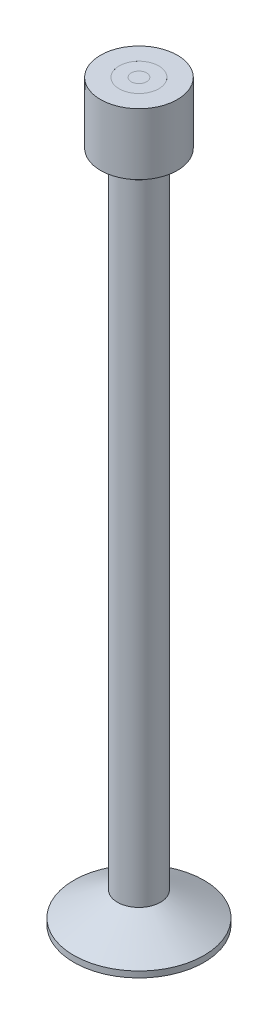
ISO-10303-21;
HEADER;
FILE_DESCRIPTION(('STEP AP214'),'2;1');
FILE_NAME('part.step','',(''),(''),'','','');
FILE_SCHEMA(('AUTOMOTIVE_DESIGN { 1 0 10303 214 1 1 1 1 }'));
ENDSEC;
DATA;
#1=APPLICATION_CONTEXT('core data for automotive mechanical design processes');
#2=APPLICATION_PROTOCOL_DEFINITION('international standard','automotive_design',2000,#1);
#3=PRODUCT_CONTEXT('',#1,'mechanical');
#4=PRODUCT('Part','Part','',(#3));
#5=PRODUCT_RELATED_PRODUCT_CATEGORY('part','',(#4));
#6=PRODUCT_DEFINITION_FORMATION('','',#4);
#7=PRODUCT_DEFINITION_CONTEXT('part definition',#1,'design');
#8=PRODUCT_DEFINITION('design','',#6,#7);
#9=PRODUCT_DEFINITION_SHAPE('','',#8);
#10=(LENGTH_UNIT() NAMED_UNIT(*) SI_UNIT(.MILLI.,.METRE.));
#11=(NAMED_UNIT(*) PLANE_ANGLE_UNIT() SI_UNIT($,.RADIAN.));
#12=(NAMED_UNIT(*) SI_UNIT($,.STERADIAN.) SOLID_ANGLE_UNIT());
#13=UNCERTAINTY_MEASURE_WITH_UNIT(LENGTH_MEASURE(1.E-05),#10,'distance_accuracy_value','');
#14=(GEOMETRIC_REPRESENTATION_CONTEXT(3) GLOBAL_UNCERTAINTY_ASSIGNED_CONTEXT((#13)) GLOBAL_UNIT_ASSIGNED_CONTEXT((#10,
#11,#12)) REPRESENTATION_CONTEXT('',''));
#15=CARTESIAN_POINT('',(0.,0.,0.));
#16=DIRECTION('',(0.,0.,1.));
#17=DIRECTION('',(1.,0.,0.));
#18=AXIS2_PLACEMENT_3D('',#15,#16,#17);
#19=CARTESIAN_POINT('',(0.,55.5,0.));
#20=DIRECTION('',(0.,1.,0.));
#21=DIRECTION('',(0.,0.,1.));
#22=AXIS2_PLACEMENT_3D('',#19,#20,#21);
#23=CYLINDRICAL_SURFACE('',#22,0.375);
#24=CARTESIAN_POINT('',(0.,0.,0.));
#25=DIRECTION('',(0.,1.,0.));
#26=DIRECTION('',(0.,0.,1.));
#27=AXIS2_PLACEMENT_3D('',#24,#25,#26);
#28=CIRCLE('',#27,0.375);
#29=CARTESIAN_POINT('',(0.,0.,0.375));
#30=VERTEX_POINT('',#29);
#31=EDGE_CURVE('E64',#30,#30,#28,.T.);
#32=ORIENTED_EDGE('',*,*,#31,.F.);
#33=EDGE_LOOP('',(#32));
#34=FACE_BOUND('',#33,.T.);
#35=CARTESIAN_POINT('',(0.,54.9421933085502,0.));
#36=DIRECTION('',(0.,1.,0.));
#37=DIRECTION('',(0.,0.,1.));
#38=AXIS2_PLACEMENT_3D('',#35,#36,#37);
#39=CIRCLE('',#38,0.375);
#40=CARTESIAN_POINT('',(0.,54.9421933085502,0.375));
#41=VERTEX_POINT('',#40);
#42=EDGE_CURVE('E11',#41,#41,#39,.T.);
#43=ORIENTED_EDGE('',*,*,#42,.T.);
#44=EDGE_LOOP('',(#43));
#45=FACE_BOUND('',#44,.T.);
#46=ADVANCED_FACE('F42',(#34,#45),#23,.F.);
#47=CARTESIAN_POINT('',(0.,60.571,0.));
#48=DIRECTION('',(0.,1.,0.));
#49=DIRECTION('',(0.,0.,1.));
#50=AXIS2_PLACEMENT_3D('',#47,#48,#49);
#51=CONICAL_SURFACE('',#50,0.635000000000092,0.0461581536129454);
#52=ORIENTED_EDGE('',*,*,#42,.F.);
#53=EDGE_LOOP('',(#52));
#54=FACE_BOUND('',#53,.T.);
#55=CARTESIAN_POINT('',(0.,60.571,0.));
#56=DIRECTION('',(0.,1.,0.));
#57=DIRECTION('',(0.,0.,1.));
#58=AXIS2_PLACEMENT_3D('',#55,#56,#57);
#59=CIRCLE('',#58,0.635000000000092);
#60=CARTESIAN_POINT('',(0.,60.571,0.635000000000092));
#61=VERTEX_POINT('',#60);
#62=EDGE_CURVE('E48',#61,#61,#59,.T.);
#63=ORIENTED_EDGE('',*,*,#62,.T.);
#64=EDGE_LOOP('',(#63));
#65=FACE_BOUND('',#64,.T.);
#66=ADVANCED_FACE('F71',(#54,#65),#51,.F.);
#67=CARTESIAN_POINT('',(0.635000000000092,60.571,0.));
#68=DIRECTION('',(0.,-1.,0.));
#69=DIRECTION('',(0.,0.,-1.));
#70=AXIS2_PLACEMENT_3D('',#67,#68,#69);
#71=PLANE('',#70);
#72=ORIENTED_EDGE('',*,*,#62,.F.);
#73=EDGE_LOOP('',(#72));
#74=FACE_BOUND('',#73,.T.);
#75=CARTESIAN_POINT('',(0.,60.571,0.));
#76=DIRECTION('',(0.,1.,0.));
#77=DIRECTION('',(0.,0.,1.));
#78=AXIS2_PLACEMENT_3D('',#75,#76,#77);
#79=CIRCLE('',#78,1.63500000000009);
#80=CARTESIAN_POINT('',(0.,60.571,1.63500000000009));
#81=VERTEX_POINT('',#80);
#82=EDGE_CURVE('E52',#81,#81,#79,.T.);
#83=ORIENTED_EDGE('',*,*,#82,.T.);
#84=EDGE_LOOP('',(#83));
#85=FACE_BOUND('',#84,.T.);
#86=ADVANCED_FACE('F75',(#74,#85),#71,.F.);
#87=CARTESIAN_POINT('',(0.,54.9421933085502,0.));
#88=DIRECTION('',(0.,1.,0.));
#89=DIRECTION('',(0.,0.,1.));
#90=AXIS2_PLACEMENT_3D('',#87,#88,#89);
#91=CONICAL_SURFACE('',#90,1.37500000000001,0.0461581536129434);
#92=ORIENTED_EDGE('',*,*,#82,.F.);
#93=EDGE_LOOP('',(#92));
#94=FACE_BOUND('',#93,.T.);
#95=CARTESIAN_POINT('',(0.,54.9421933085502,0.));
#96=DIRECTION('',(0.,1.,0.));
#97=DIRECTION('',(0.,0.,1.));
#98=AXIS2_PLACEMENT_3D('',#95,#96,#97);
#99=CIRCLE('',#98,1.37500000000001);
#100=CARTESIAN_POINT('',(0.,54.9421933085502,1.37500000000001));
#101=VERTEX_POINT('',#100);
#102=EDGE_CURVE('E56',#101,#101,#99,.T.);
#103=ORIENTED_EDGE('',*,*,#102,.T.);
#104=EDGE_LOOP('',(#103));
#105=FACE_BOUND('',#104,.T.);
#106=ADVANCED_FACE('F80',(#94,#105),#91,.T.);
#107=CARTESIAN_POINT('',(0.,55.5,0.));
#108=DIRECTION('',(0.,1.,0.));
#109=DIRECTION('',(0.,0.,1.));
#110=AXIS2_PLACEMENT_3D('',#107,#108,#109);
#111=CYLINDRICAL_SURFACE('',#110,1.37500000000001);
#112=ORIENTED_EDGE('',*,*,#102,.F.);
#113=EDGE_LOOP('',(#112));
#114=FACE_BOUND('',#113,.T.);
#115=CARTESIAN_POINT('',(0.,0.,0.));
#116=DIRECTION('',(0.,1.,0.));
#117=DIRECTION('',(0.,0.,1.));
#118=AXIS2_PLACEMENT_3D('',#115,#116,#117);
#119=CIRCLE('',#118,1.37500000000001);
#120=CARTESIAN_POINT('',(0.,0.,1.37500000000001));
#121=VERTEX_POINT('',#120);
#122=EDGE_CURVE('E61',#121,#121,#119,.T.);
#123=ORIENTED_EDGE('',*,*,#122,.T.);
#124=EDGE_LOOP('',(#123));
#125=FACE_BOUND('',#124,.T.);
#126=ADVANCED_FACE('F86',(#114,#125),#111,.T.);
#127=CARTESIAN_POINT('',(0.375,0.,0.));
#128=DIRECTION('',(0.,1.,0.));
#129=DIRECTION('',(0.,0.,1.));
#130=AXIS2_PLACEMENT_3D('',#127,#128,#129);
#131=PLANE('',#130);
#132=ORIENTED_EDGE('',*,*,#122,.F.);
#133=EDGE_LOOP('',(#132));
#134=FACE_BOUND('',#133,.T.);
#135=ORIENTED_EDGE('',*,*,#31,.T.);
#136=EDGE_LOOP('',(#135));
#137=FACE_BOUND('',#136,.T.);
#138=ADVANCED_FACE('F68',(#134,#137),#131,.F.);
#139=CLOSED_SHELL('',(#46,#66,#86,#106,#126,#138));
#140=MANIFOLD_SOLID_BREP('B2',#139);
#141=CARTESIAN_POINT('',(1.37500000000001,0.,0.));
#142=DIRECTION('',(0.,1.,0.));
#143=DIRECTION('',(-1.,0.,0.));
#144=AXIS2_PLACEMENT_3D('',#141,#142,#143);
#145=PLANE('',#144);
#146=CARTESIAN_POINT('',(0.,0.,0.));
#147=DIRECTION('',(0.,1.,0.));
#148=DIRECTION('',(-1.,0.,0.));
#149=AXIS2_PLACEMENT_3D('',#146,#147,#148);
#150=CIRCLE('',#149,5.375);
#151=CARTESIAN_POINT('',(-5.375,0.,0.));
#152=VERTEX_POINT('',#151);
#153=EDGE_CURVE('E41',#152,#152,#150,.T.);
#154=ORIENTED_EDGE('',*,*,#153,.F.);
#155=EDGE_LOOP('',(#154));
#156=FACE_BOUND('',#155,.T.);
#157=CARTESIAN_POINT('',(0.,0.,0.));
#158=DIRECTION('',(0.,1.,0.));
#159=DIRECTION('',(-1.,0.,0.));
#160=AXIS2_PLACEMENT_3D('',#157,#158,#159);
#161=CIRCLE('',#160,1.37500000000001);
#162=CARTESIAN_POINT('',(-1.37500000000001,0.,0.));
#163=VERTEX_POINT('',#162);
#164=EDGE_CURVE('E184',#163,#163,#161,.T.);
#165=ORIENTED_EDGE('',*,*,#164,.T.);
#166=EDGE_LOOP('',(#165));
#167=FACE_BOUND('',#166,.T.);
#168=ADVANCED_FACE('F153',(#156,#167),#145,.F.);
#169=CARTESIAN_POINT('',(0.,60.571,0.));
#170=DIRECTION('',(0.,1.,0.));
#171=DIRECTION('',(-1.,0.,0.));
#172=AXIS2_PLACEMENT_3D('',#169,#170,#171);
#173=CYLINDRICAL_SURFACE('',#172,5.375);
#174=CARTESIAN_POINT('',(0.,0.5,0.));
#175=DIRECTION('',(0.,1.,0.));
#176=DIRECTION('',(-1.,0.,0.));
#177=AXIS2_PLACEMENT_3D('',#174,#175,#176);
#178=CIRCLE('',#177,5.375);
#179=CARTESIAN_POINT('',(5.375,0.500000000000001,0.));
#180=VERTEX_POINT('',#179);
#181=EDGE_CURVE('E159',#180,#180,#178,.T.);
#182=ORIENTED_EDGE('',*,*,#181,.F.);
#183=EDGE_LOOP('',(#182));
#184=FACE_BOUND('',#183,.T.);
#185=ORIENTED_EDGE('',*,*,#153,.T.);
#186=EDGE_LOOP('',(#185));
#187=FACE_BOUND('',#186,.T.);
#188=ADVANCED_FACE('F227',(#184,#187),#173,.T.);
#189=CARTESIAN_POINT('',(0.,0.5,0.));
#190=DIRECTION('',(0.,-1.,0.));
#191=DIRECTION('',(1.,0.,0.));
#192=AXIS2_PLACEMENT_3D('',#189,#190,#191);
#193=CONICAL_SURFACE('',#192,5.375,1.06310757338599);
#194=CARTESIAN_POINT('',(0.,2.5,0.));
#195=DIRECTION('',(0.,1.,0.));
#196=DIRECTION('',(-1.,0.,0.));
#197=AXIS2_PLACEMENT_3D('',#194,#195,#196);
#198=CIRCLE('',#197,1.78);
#199=CARTESIAN_POINT('',(1.78,2.5,0.));
#200=VERTEX_POINT('',#199);
#201=EDGE_CURVE('E163',#200,#200,#198,.T.);
#202=CARTESIAN_POINT('',(1.78,2.5,0.));
#203=CARTESIAN_POINT('',(1.81744791666667,2.47916666666667,0.));
#204=CARTESIAN_POINT('',(1.85489583333333,2.45833333333334,0.));
#205=CARTESIAN_POINT('',(1.92979166666667,2.41666666666667,0.));
#206=CARTESIAN_POINT('',(1.96723958333333,2.39583333333334,0.));
#207=CARTESIAN_POINT('',(2.04213541666667,2.35416666666667,0.));
#208=CARTESIAN_POINT('',(2.07958333333333,2.33333333333334,0.));
#209=CARTESIAN_POINT('',(2.15447916666667,2.29166666666667,0.));
#210=CARTESIAN_POINT('',(2.19192708333333,2.27083333333334,0.));
#211=CARTESIAN_POINT('',(2.26682291666667,2.22916666666667,0.));
#212=CARTESIAN_POINT('',(2.30427083333333,2.20833333333334,0.));
#213=CARTESIAN_POINT('',(2.37916666666667,2.16666666666667,0.));
#214=CARTESIAN_POINT('',(2.41661458333333,2.14583333333334,0.));
#215=CARTESIAN_POINT('',(2.49151041666667,2.10416666666667,0.));
#216=CARTESIAN_POINT('',(2.52895833333333,2.08333333333334,0.));
#217=CARTESIAN_POINT('',(2.60385416666667,2.04166666666667,0.));
#218=CARTESIAN_POINT('',(2.64130208333333,2.02083333333333,0.));
#219=CARTESIAN_POINT('',(2.71619791666667,1.97916666666667,0.));
#220=CARTESIAN_POINT('',(2.75364583333333,1.95833333333334,0.));
#221=CARTESIAN_POINT('',(2.82854166666667,1.91666666666667,0.));
#222=CARTESIAN_POINT('',(2.86598958333333,1.89583333333334,0.));
#223=CARTESIAN_POINT('',(2.94088541666667,1.85416666666667,0.));
#224=CARTESIAN_POINT('',(2.97833333333333,1.83333333333334,0.));
#225=CARTESIAN_POINT('',(3.05322916666667,1.79166666666667,0.));
#226=CARTESIAN_POINT('',(3.09067708333333,1.77083333333334,0.));
#227=CARTESIAN_POINT('',(3.16557291666667,1.72916666666667,0.));
#228=CARTESIAN_POINT('',(3.20302083333333,1.70833333333333,0.));
#229=CARTESIAN_POINT('',(3.27791666666667,1.66666666666667,0.));
#230=CARTESIAN_POINT('',(3.31536458333333,1.64583333333333,0.));
#231=CARTESIAN_POINT('',(3.39026041666667,1.60416666666667,0.));
#232=CARTESIAN_POINT('',(3.42770833333333,1.58333333333333,0.));
#233=CARTESIAN_POINT('',(3.50260416666667,1.54166666666667,0.));
#234=CARTESIAN_POINT('',(3.54005208333333,1.52083333333333,0.));
#235=CARTESIAN_POINT('',(3.61494791666667,1.47916666666667,0.));
#236=CARTESIAN_POINT('',(3.65239583333333,1.45833333333333,0.));
#237=CARTESIAN_POINT('',(3.72729166666667,1.41666666666667,0.));
#238=CARTESIAN_POINT('',(3.76473958333333,1.39583333333333,0.));
#239=CARTESIAN_POINT('',(3.83963541666667,1.35416666666667,0.));
#240=CARTESIAN_POINT('',(3.87708333333333,1.33333333333333,0.));
#241=CARTESIAN_POINT('',(3.95197916666667,1.29166666666667,0.));
#242=CARTESIAN_POINT('',(3.98942708333333,1.27083333333333,0.));
#243=CARTESIAN_POINT('',(4.06432291666667,1.22916666666667,0.));
#244=CARTESIAN_POINT('',(4.10177083333333,1.20833333333333,0.));
#245=CARTESIAN_POINT('',(4.17666666666667,1.16666666666667,0.));
#246=CARTESIAN_POINT('',(4.21411458333333,1.14583333333333,0.));
#247=CARTESIAN_POINT('',(4.28901041666667,1.10416666666667,0.));
#248=CARTESIAN_POINT('',(4.32645833333333,1.08333333333333,0.));
#249=CARTESIAN_POINT('',(4.40135416666667,1.04166666666667,0.));
#250=CARTESIAN_POINT('',(4.43880208333333,1.02083333333333,0.));
#251=CARTESIAN_POINT('',(4.51369791666667,0.979166666666668,0.));
#252=CARTESIAN_POINT('',(4.55114583333333,0.958333333333334,0.));
#253=CARTESIAN_POINT('',(4.62604166666667,0.916666666666667,0.));
#254=CARTESIAN_POINT('',(4.66348958333333,0.895833333333334,0.));
#255=CARTESIAN_POINT('',(4.73838541666667,0.854166666666667,0.));
#256=CARTESIAN_POINT('',(4.77583333333333,0.833333333333334,0.));
#257=CARTESIAN_POINT('',(4.85072916666667,0.791666666666667,0.));
#258=CARTESIAN_POINT('',(4.88817708333333,0.770833333333334,0.));
#259=CARTESIAN_POINT('',(4.96307291666667,0.729166666666667,0.));
#260=CARTESIAN_POINT('',(5.00052083333333,0.708333333333334,0.));
#261=CARTESIAN_POINT('',(5.07541666666667,0.666666666666667,0.));
#262=CARTESIAN_POINT('',(5.11286458333333,0.645833333333334,0.));
#263=CARTESIAN_POINT('',(5.18776041666667,0.604166666666667,0.));
#264=CARTESIAN_POINT('',(5.22520833333333,0.583333333333334,0.));
#265=CARTESIAN_POINT('',(5.30010416666667,0.541666666666667,0.));
#266=CARTESIAN_POINT('',(5.33755208333333,0.520833333333334,0.));
#267=CARTESIAN_POINT('',(5.375,0.5,0.));
#268=B_SPLINE_CURVE_WITH_KNOTS('',3,(#202,#203,#204,#205,#206,#207,#208,#209,#210,#211,#212,
#213,#214,#215,#216,#217,#218,#219,#220,#221,#222,#223,#224,#225,#226,#227,#228,#229,#230,#231,
#232,#233,#234,#235,#236,#237,#238,#239,#240,#241,#242,#243,#244,#245,#246,#247,#248,#249,#250,
#251,#252,#253,#254,#255,#256,#257,#258,#259,#260,#261,#262,#263,#264,#265,#266,#267),
.UNSPECIFIED.,.F.,.F.,(4,2,2,2,2,2,2,2,2,2,2,2,2,2,2,2,2,2,2,2,2,2,2,2,2,2,2,2,2,2,2,2,4),(0.,
0.128558812082496,0.257117624164992,0.385676436247487,0.514235248329983,0.642794060412479,
0.771352872494975,0.899911684577471,1.02847049665997,1.15702930874246,1.28558812082496,
1.41414693290746,1.54270574498995,1.67126455707245,1.79982336915494,1.92838218123744,
2.05694099331993,2.18549980540243,2.31405861748493,2.44261742956742,2.57117624164992,
2.69973505373241,2.82829386581491,2.9568526778974,3.0854114899799,3.2139703020624,
3.34252911414489,3.47108792622739,3.59964673830988,3.72820555039238,3.85676436247488,
3.98532317455737,4.11388198663987),.UNSPECIFIED.);
#269=EDGE_CURVE('BSEAM222',#200,#180,#268,.T.);
#270=ORIENTED_EDGE('',*,*,#201,.F.);
#271=ORIENTED_EDGE('',*,*,#181,.T.);
#272=ORIENTED_EDGE('',*,*,#269,.T.);
#273=ORIENTED_EDGE('',*,*,#269,.F.);
#274=EDGE_LOOP('',(#270,#272,#271,#273));
#275=FACE_BOUND('',#274,.T.);
#276=ADVANCED_FACE('F222',(#275),#193,.T.);
#277=CARTESIAN_POINT('',(0.,60.571,0.));
#278=DIRECTION('',(0.,1.,0.));
#279=DIRECTION('',(-1.,0.,0.));
#280=AXIS2_PLACEMENT_3D('',#277,#278,#279);
#281=CYLINDRICAL_SURFACE('',#280,1.78);
#282=CARTESIAN_POINT('',(0.,54.5,0.));
#283=DIRECTION('',(0.,1.,0.));
#284=DIRECTION('',(-1.,0.,0.));
#285=AXIS2_PLACEMENT_3D('',#282,#283,#284);
#286=CIRCLE('',#285,1.78);
#287=CARTESIAN_POINT('',(-1.78,54.5,0.));
#288=VERTEX_POINT('',#287);
#289=EDGE_CURVE('E167',#288,#288,#286,.T.);
#290=ORIENTED_EDGE('',*,*,#289,.F.);
#291=EDGE_LOOP('',(#290));
#292=FACE_BOUND('',#291,.T.);
#293=ORIENTED_EDGE('',*,*,#201,.T.);
#294=EDGE_LOOP('',(#293));
#295=FACE_BOUND('',#294,.T.);
#296=ADVANCED_FACE('F216',(#292,#295),#281,.T.);
#297=CARTESIAN_POINT('',(0.,54.5,0.));
#298=DIRECTION('',(0.,1.,0.));
#299=DIRECTION('',(-1.,0.,0.));
#300=AXIS2_PLACEMENT_3D('',#297,#298,#299);
#301=CONICAL_SURFACE('',#300,1.78,0.947760988153379);
#302=CARTESIAN_POINT('',(0.,55.5,0.));
#303=DIRECTION('',(0.,1.,0.));
#304=DIRECTION('',(-1.,0.,0.));
#305=AXIS2_PLACEMENT_3D('',#302,#303,#304);
#306=CIRCLE('',#305,3.17178589149484);
#307=CARTESIAN_POINT('',(-3.17178589149484,55.5,0.));
#308=VERTEX_POINT('',#307);
#309=EDGE_CURVE('E172',#308,#308,#306,.T.);
#310=ORIENTED_EDGE('',*,*,#309,.F.);
#311=EDGE_LOOP('',(#310));
#312=FACE_BOUND('',#311,.T.);
#313=ORIENTED_EDGE('',*,*,#289,.T.);
#314=EDGE_LOOP('',(#313));
#315=FACE_BOUND('',#314,.T.);
#316=ADVANCED_FACE('F210',(#312,#315),#301,.T.);
#317=CARTESIAN_POINT('',(0.,60.571,0.));
#318=DIRECTION('',(0.,1.,0.));
#319=DIRECTION('',(-1.,0.,0.));
#320=AXIS2_PLACEMENT_3D('',#317,#318,#319);
#321=CYLINDRICAL_SURFACE('',#320,3.17178589149484);
#322=CARTESIAN_POINT('',(0.,60.571,0.));
#323=DIRECTION('',(0.,1.,0.));
#324=DIRECTION('',(-1.,0.,0.));
#325=AXIS2_PLACEMENT_3D('',#322,#323,#324);
#326=CIRCLE('',#325,3.17178589149484);
#327=CARTESIAN_POINT('',(-3.17178589149484,60.571,0.));
#328=VERTEX_POINT('',#327);
#329=EDGE_CURVE('E175',#328,#328,#326,.T.);
#330=ORIENTED_EDGE('',*,*,#329,.F.);
#331=EDGE_LOOP('',(#330));
#332=FACE_BOUND('',#331,.T.);
#333=ORIENTED_EDGE('',*,*,#309,.T.);
#334=EDGE_LOOP('',(#333));
#335=FACE_BOUND('',#334,.T.);
#336=ADVANCED_FACE('F204',(#332,#335),#321,.T.);
#337=CARTESIAN_POINT('',(3.17178589149484,60.571,0.));
#338=DIRECTION('',(0.,-1.,0.));
#339=DIRECTION('',(1.,0.,0.));
#340=AXIS2_PLACEMENT_3D('',#337,#338,#339);
#341=PLANE('',#340);
#342=CARTESIAN_POINT('',(0.,60.571,0.));
#343=DIRECTION('',(0.,1.,0.));
#344=DIRECTION('',(-1.,0.,0.));
#345=AXIS2_PLACEMENT_3D('',#342,#343,#344);
#346=CIRCLE('',#345,1.63500000000009);
#347=CARTESIAN_POINT('',(-1.63500000000009,60.571,0.));
#348=VERTEX_POINT('',#347);
#349=EDGE_CURVE('E178',#348,#348,#346,.T.);
#350=ORIENTED_EDGE('',*,*,#349,.F.);
#351=EDGE_LOOP('',(#350));
#352=FACE_BOUND('',#351,.T.);
#353=ORIENTED_EDGE('',*,*,#329,.T.);
#354=EDGE_LOOP('',(#353));
#355=FACE_BOUND('',#354,.T.);
#356=ADVANCED_FACE('F198',(#352,#355),#341,.F.);
#357=CARTESIAN_POINT('',(0.,60.571,0.));
#358=DIRECTION('',(0.,1.,0.));
#359=DIRECTION('',(-1.,0.,0.));
#360=AXIS2_PLACEMENT_3D('',#357,#358,#359);
#361=CONICAL_SURFACE('',#360,1.63500000000009,0.0461581536129434);
#362=CARTESIAN_POINT('',(0.,54.9421933085502,0.));
#363=DIRECTION('',(0.,1.,0.));
#364=DIRECTION('',(-1.,0.,0.));
#365=AXIS2_PLACEMENT_3D('',#362,#363,#364);
#366=CIRCLE('',#365,1.37500000000001);
#367=CARTESIAN_POINT('',(-1.37500000000001,54.9421933085502,0.));
#368=VERTEX_POINT('',#367);
#369=EDGE_CURVE('E181',#368,#368,#366,.T.);
#370=ORIENTED_EDGE('',*,*,#369,.F.);
#371=EDGE_LOOP('',(#370));
#372=FACE_BOUND('',#371,.T.);
#373=ORIENTED_EDGE('',*,*,#349,.T.);
#374=EDGE_LOOP('',(#373));
#375=FACE_BOUND('',#374,.T.);
#376=ADVANCED_FACE('F192',(#372,#375),#361,.F.);
#377=CARTESIAN_POINT('',(0.,60.571,0.));
#378=DIRECTION('',(0.,1.,0.));
#379=DIRECTION('',(-1.,0.,0.));
#380=AXIS2_PLACEMENT_3D('',#377,#378,#379);
#381=CYLINDRICAL_SURFACE('',#380,1.37500000000001);
#382=ORIENTED_EDGE('',*,*,#164,.F.);
#383=EDGE_LOOP('',(#382));
#384=FACE_BOUND('',#383,.T.);
#385=ORIENTED_EDGE('',*,*,#369,.T.);
#386=EDGE_LOOP('',(#385));
#387=FACE_BOUND('',#386,.T.);
#388=ADVANCED_FACE('F189',(#384,#387),#381,.F.);
#389=CLOSED_SHELL('',(#168,#188,#276,#296,#316,#336,#356,#376,#388));
#390=MANIFOLD_SOLID_BREP('B6',#389);
#391=CARTESIAN_POINT('',(0.63500000000009,60.571,0.));
#392=DIRECTION('',(0.,-1.,0.));
#393=DIRECTION('',(1.,0.,0.));
#394=AXIS2_PLACEMENT_3D('',#391,#392,#393);
#395=PLANE('',#394);
#396=CARTESIAN_POINT('',(0.,60.571,0.));
#397=DIRECTION('',(0.,1.,0.));
#398=DIRECTION('',(-1.,0.,0.));
#399=AXIS2_PLACEMENT_3D('',#396,#397,#398);
#400=CIRCLE('',#399,0.63500000000009);
#401=CARTESIAN_POINT('',(-0.63500000000009,60.571,0.));
#402=VERTEX_POINT('',#401);
#403=EDGE_CURVE('E152',#402,#402,#400,.T.);
#404=ORIENTED_EDGE('',*,*,#403,.T.);
#405=EDGE_LOOP('',(#404));
#406=FACE_BOUND('',#405,.T.);
#407=ADVANCED_FACE('F294',(#406),#395,.F.);
#408=CARTESIAN_POINT('',(0.,54.9421933085502,0.));
#409=DIRECTION('',(0.,1.,0.));
#410=DIRECTION('',(-1.,0.,0.));
#411=AXIS2_PLACEMENT_3D('',#408,#409,#410);
#412=CONICAL_SURFACE('',#411,0.375,0.0461581536129451);
#413=ORIENTED_EDGE('',*,*,#403,.F.);
#414=EDGE_LOOP('',(#413));
#415=FACE_BOUND('',#414,.T.);
#416=CARTESIAN_POINT('',(0.,54.9421933085502,0.));
#417=DIRECTION('',(0.,1.,0.));
#418=DIRECTION('',(-1.,0.,0.));
#419=AXIS2_PLACEMENT_3D('',#416,#417,#418);
#420=CIRCLE('',#419,0.375);
#421=CARTESIAN_POINT('',(-0.375,54.9421933085502,0.));
#422=VERTEX_POINT('',#421);
#423=EDGE_CURVE('E300',#422,#422,#420,.T.);
#424=ORIENTED_EDGE('',*,*,#423,.T.);
#425=EDGE_LOOP('',(#424));
#426=FACE_BOUND('',#425,.T.);
#427=ADVANCED_FACE('F319',(#415,#426),#412,.T.);
#428=CARTESIAN_POINT('',(0.,60.571,0.));
#429=DIRECTION('',(0.,1.,0.));
#430=DIRECTION('',(-1.,0.,0.));
#431=AXIS2_PLACEMENT_3D('',#428,#429,#430);
#432=CYLINDRICAL_SURFACE('',#431,0.375);
#433=ORIENTED_EDGE('',*,*,#423,.F.);
#434=EDGE_LOOP('',(#433));
#435=FACE_BOUND('',#434,.T.);
#436=CARTESIAN_POINT('',(0.,0.,0.));
#437=DIRECTION('',(0.,1.,0.));
#438=DIRECTION('',(-1.,0.,0.));
#439=AXIS2_PLACEMENT_3D('',#436,#437,#438);
#440=CIRCLE('',#439,0.375);
#441=CARTESIAN_POINT('',(-0.375,0.,0.));
#442=VERTEX_POINT('',#441);
#443=EDGE_CURVE('E304',#442,#442,#440,.T.);
#444=ORIENTED_EDGE('',*,*,#443,.T.);
#445=EDGE_LOOP('',(#444));
#446=FACE_BOUND('',#445,.T.);
#447=ADVANCED_FACE('F311',(#435,#446),#432,.T.);
#448=CARTESIAN_POINT('',(0.375,0.,0.));
#449=DIRECTION('',(0.,1.,0.));
#450=DIRECTION('',(-1.,0.,0.));
#451=AXIS2_PLACEMENT_3D('',#448,#449,#450);
#452=PLANE('',#451);
#453=ORIENTED_EDGE('',*,*,#443,.F.);
#454=EDGE_LOOP('',(#453));
#455=FACE_BOUND('',#454,.T.);
#456=ADVANCED_FACE('F313',(#455),#452,.F.);
#457=CLOSED_SHELL('',(#407,#427,#447,#456));
#458=MANIFOLD_SOLID_BREP('B36',#457);
#459=ADVANCED_BREP_SHAPE_REPRESENTATION('',(#18,#140,#390,#458),#14);
#460=SHAPE_DEFINITION_REPRESENTATION(#9,#459);
ENDSEC;
END-ISO-10303-21;
